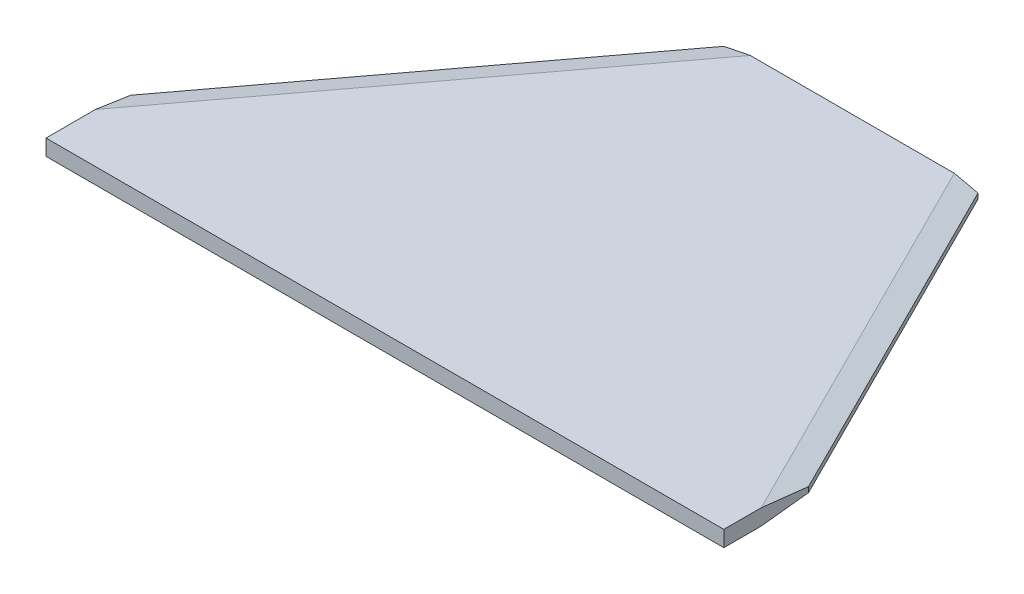
ISO-10303-21;
HEADER;
FILE_DESCRIPTION(('STEP AP214'),'2;1');
FILE_NAME('part.step','',(''),(''),'','','');
FILE_SCHEMA(('AUTOMOTIVE_DESIGN { 1 0 10303 214 1 1 1 1 }'));
ENDSEC;
DATA;
#1=APPLICATION_CONTEXT('core data for automotive mechanical design processes');
#2=APPLICATION_PROTOCOL_DEFINITION('international standard','automotive_design',2000,#1);
#3=PRODUCT_CONTEXT('',#1,'mechanical');
#4=PRODUCT('Part','Part','',(#3));
#5=PRODUCT_RELATED_PRODUCT_CATEGORY('part','',(#4));
#6=PRODUCT_DEFINITION_FORMATION('','',#4);
#7=PRODUCT_DEFINITION_CONTEXT('part definition',#1,'design');
#8=PRODUCT_DEFINITION('design','',#6,#7);
#9=PRODUCT_DEFINITION_SHAPE('','',#8);
#10=(LENGTH_UNIT() NAMED_UNIT(*) SI_UNIT(.MILLI.,.METRE.));
#11=(NAMED_UNIT(*) PLANE_ANGLE_UNIT() SI_UNIT($,.RADIAN.));
#12=(NAMED_UNIT(*) SI_UNIT($,.STERADIAN.) SOLID_ANGLE_UNIT());
#13=UNCERTAINTY_MEASURE_WITH_UNIT(LENGTH_MEASURE(1.E-05),#10,'distance_accuracy_value','');
#14=(GEOMETRIC_REPRESENTATION_CONTEXT(3) GLOBAL_UNCERTAINTY_ASSIGNED_CONTEXT((#13)) GLOBAL_UNIT_ASSIGNED_CONTEXT((#10,
#11,#12)) REPRESENTATION_CONTEXT('',''));
#15=CARTESIAN_POINT('',(0.,0.,0.));
#16=DIRECTION('',(0.,0.,1.));
#17=DIRECTION('',(1.,0.,0.));
#18=AXIS2_PLACEMENT_3D('',#15,#16,#17);
#19=CARTESIAN_POINT('',(76.2,-2.38125,-127.));
#20=DIRECTION('',(0.,0.,1.));
#21=DIRECTION('',(1.,0.,0.));
#22=AXIS2_PLACEMENT_3D('',#19,#20,#21);
#23=PLANE('',#22);
#24=DIRECTION('',(0.,1.,0.));
#25=VECTOR('',#24,1.);
#26=CARTESIAN_POINT('',(76.2,-2.38125,-127.));
#27=LINE('',#26,#25);
#28=CARTESIAN_POINT('',(76.2,-0.793749999999987,-127.));
#29=VERTEX_POINT('',#28);
#30=CARTESIAN_POINT('',(76.2,0.793750000000008,-127.));
#31=VERTEX_POINT('',#30);
#32=EDGE_CURVE('E149',#29,#31,#27,.T.);
#33=ORIENTED_EDGE('',*,*,#32,.T.);
#34=DIRECTION('',(-0.980580675690921,-0.196116135138182,0.));
#35=VECTOR('',#34,1.);
#36=CARTESIAN_POINT('',(2.93076923076917,-13.860096153846,-127.));
#37=LINE('',#36,#35);
#38=CARTESIAN_POINT('',(84.1375000000001,2.38125,-127.));
#39=VERTEX_POINT('',#38);
#40=EDGE_CURVE('E58',#31,#39,#37,.F.);
#41=ORIENTED_EDGE('',*,*,#40,.T.);
#42=DIRECTION('',(1.,0.,0.));
#43=VECTOR('',#42,1.);
#44=CARTESIAN_POINT('',(76.2,2.38125,-127.));
#45=LINE('',#44,#43);
#46=CARTESIAN_POINT('',(145.300484171438,2.38125,-127.));
#47=VERTEX_POINT('',#46);
#48=EDGE_CURVE('E124',#39,#47,#45,.T.);
#49=ORIENTED_EDGE('',*,*,#48,.T.);
#50=DIRECTION('',(-0.975900072948532,0.218217890235998,0.));
#51=VECTOR('',#50,1.);
#52=CARTESIAN_POINT('',(152.4,0.793749999999956,-127.));
#53=LINE('',#52,#51);
#54=CARTESIAN_POINT('',(152.4,0.793749999999956,-127.));
#55=VERTEX_POINT('',#54);
#56=EDGE_CURVE('E167',#47,#55,#53,.F.);
#57=ORIENTED_EDGE('',*,*,#56,.T.);
#58=DIRECTION('',(0.,1.,0.));
#59=VECTOR('',#58,1.);
#60=CARTESIAN_POINT('',(152.4,-2.38125,-127.));
#61=LINE('',#60,#59);
#62=CARTESIAN_POINT('',(152.4,-0.793750000000001,-127.));
#63=VERTEX_POINT('',#62);
#64=EDGE_CURVE('E156',#63,#55,#61,.T.);
#65=ORIENTED_EDGE('',*,*,#64,.F.);
#66=DIRECTION('',(-0.975900072948534,-0.21821789023599,0.));
#67=VECTOR('',#66,1.);
#68=CARTESIAN_POINT('',(166.005153853069,2.2484548859805,-127.));
#69=LINE('',#68,#67);
#70=CARTESIAN_POINT('',(145.300484171438,-2.38125,-127.));
#71=VERTEX_POINT('',#70);
#72=EDGE_CURVE('E165',#63,#71,#69,.T.);
#73=ORIENTED_EDGE('',*,*,#72,.T.);
#74=DIRECTION('',(1.,0.,0.));
#75=VECTOR('',#74,1.);
#76=CARTESIAN_POINT('',(76.2,-2.38125,-127.));
#77=LINE('',#76,#75);
#78=CARTESIAN_POINT('',(84.1375000000002,-2.38125,-127.));
#79=VERTEX_POINT('',#78);
#80=EDGE_CURVE('E137',#79,#71,#77,.T.);
#81=ORIENTED_EDGE('',*,*,#80,.F.);
#82=DIRECTION('',(-0.980580675690921,0.196116135138181,0.));
#83=VECTOR('',#82,1.);
#84=CARTESIAN_POINT('',(-3.60240384615383,15.1667307692305,-127.));
#85=LINE('',#84,#83);
#86=EDGE_CURVE('E169',#79,#29,#85,.T.);
#87=ORIENTED_EDGE('',*,*,#86,.T.);
#88=EDGE_LOOP('',(#33,#41,#49,#57,#65,#73,#81,#87));
#89=FACE_BOUND('',#88,.T.);
#90=ADVANCED_FACE('F35',(#89),#23,.F.);
#91=CARTESIAN_POINT('',(152.4,-2.38125,-127.));
#92=DIRECTION('',(-0.894427190999916,0.,0.447213595499958));
#93=DIRECTION('',(0.447213595499958,0.,0.894427190999916));
#94=AXIS2_PLACEMENT_3D('',#91,#92,#93);
#95=PLANE('',#94);
#96=ORIENTED_EDGE('',*,*,#64,.T.);
#97=DIRECTION('',(0.447213595499958,0.,0.894427190999916));
#98=VECTOR('',#97,1.);
#99=CARTESIAN_POINT('',(152.4,0.793749999999957,-127.));
#100=LINE('',#99,#98);
#101=CARTESIAN_POINT('',(203.2,0.793749999999956,-25.4));
#102=VERTEX_POINT('',#101);
#103=EDGE_CURVE('E177',#55,#102,#100,.T.);
#104=ORIENTED_EDGE('',*,*,#103,.T.);
#105=DIRECTION('',(0.,1.,0.));
#106=VECTOR('',#105,1.);
#107=CARTESIAN_POINT('',(203.2,-2.38125,-25.4));
#108=LINE('',#107,#106);
#109=CARTESIAN_POINT('',(203.2,-0.793750000000001,-25.4));
#110=VERTEX_POINT('',#109);
#111=EDGE_CURVE('E131',#110,#102,#108,.T.);
#112=ORIENTED_EDGE('',*,*,#111,.F.);
#113=DIRECTION('',(-0.447213595499958,0.,-0.894427190999916));
#114=VECTOR('',#113,1.);
#115=CARTESIAN_POINT('',(152.4,-0.793750000000001,-127.));
#116=LINE('',#115,#114);
#117=EDGE_CURVE('E175',#110,#63,#116,.T.);
#118=ORIENTED_EDGE('',*,*,#117,.T.);
#119=EDGE_LOOP('',(#96,#104,#112,#118));
#120=FACE_BOUND('',#119,.T.);
#121=ADVANCED_FACE('F215',(#120),#95,.F.);
#122=CARTESIAN_POINT('',(203.2,-2.38125,-25.4));
#123=DIRECTION('',(-1.,0.,0.));
#124=DIRECTION('',(0.,0.,1.));
#125=AXIS2_PLACEMENT_3D('',#122,#123,#124);
#126=PLANE('',#125);
#127=ORIENTED_EDGE('',*,*,#111,.T.);
#128=DIRECTION('',(0.,-0.111111111111114,-0.993807989999906));
#129=VECTOR('',#128,1.);
#130=CARTESIAN_POINT('',(203.2,-10.4252379759993,-125.745679012346));
#131=LINE('',#130,#129);
#132=CARTESIAN_POINT('',(203.2,2.38125,-11.2009683428763));
#133=VERTEX_POINT('',#132);
#134=EDGE_CURVE('E119',#102,#133,#131,.F.);
#135=ORIENTED_EDGE('',*,*,#134,.T.);
#136=DIRECTION('',(0.,0.,1.));
#137=VECTOR('',#136,1.);
#138=CARTESIAN_POINT('',(203.2,2.38125,-25.4));
#139=LINE('',#138,#137);
#140=CARTESIAN_POINT('',(203.2,2.38125,0.));
#141=VERTEX_POINT('',#140);
#142=EDGE_CURVE('E112',#133,#141,#139,.T.);
#143=ORIENTED_EDGE('',*,*,#142,.T.);
#144=DIRECTION('',(0.,1.,0.));
#145=VECTOR('',#144,1.);
#146=CARTESIAN_POINT('',(203.2,-2.38125,0.));
#147=LINE('',#146,#145);
#148=CARTESIAN_POINT('',(203.2,-2.38125,0.));
#149=VERTEX_POINT('',#148);
#150=EDGE_CURVE('E117',#149,#141,#147,.T.);
#151=ORIENTED_EDGE('',*,*,#150,.F.);
#152=DIRECTION('',(0.,0.,1.));
#153=VECTOR('',#152,1.);
#154=CARTESIAN_POINT('',(203.2,-2.38125,-25.4));
#155=LINE('',#154,#153);
#156=CARTESIAN_POINT('',(203.2,-2.38125,-11.2009683428762));
#157=VERTEX_POINT('',#156);
#158=EDGE_CURVE('E143',#157,#149,#155,.T.);
#159=ORIENTED_EDGE('',*,*,#158,.F.);
#160=DIRECTION('',(0.,0.11111111111111,-0.993807989999907));
#161=VECTOR('',#160,1.);
#162=CARTESIAN_POINT('',(203.2,5.60446377325361,-82.6273637262827));
#163=LINE('',#162,#161);
#164=EDGE_CURVE('E180',#157,#110,#163,.T.);
#165=ORIENTED_EDGE('',*,*,#164,.T.);
#166=EDGE_LOOP('',(#127,#135,#143,#151,#159,#165));
#167=FACE_BOUND('',#166,.T.);
#168=ADVANCED_FACE('F115',(#167),#126,.F.);
#169=CARTESIAN_POINT('',(203.2,-2.38125,0.));
#170=DIRECTION('',(0.,0.,-1.));
#171=DIRECTION('',(-1.,0.,0.));
#172=AXIS2_PLACEMENT_3D('',#169,#170,#171);
#173=PLANE('',#172);
#174=ORIENTED_EDGE('',*,*,#150,.T.);
#175=DIRECTION('',(-1.,0.,0.));
#176=VECTOR('',#175,1.);
#177=CARTESIAN_POINT('',(203.2,2.38125,0.));
#178=LINE('',#177,#176);
#179=CARTESIAN_POINT('',(0.,2.38125,0.));
#180=VERTEX_POINT('',#179);
#181=EDGE_CURVE('E123',#141,#180,#178,.T.);
#182=ORIENTED_EDGE('',*,*,#181,.T.);
#183=DIRECTION('',(0.,1.,0.));
#184=VECTOR('',#183,1.);
#185=CARTESIAN_POINT('',(0.,-2.38125,0.));
#186=LINE('',#185,#184);
#187=CARTESIAN_POINT('',(0.,-2.38125,0.));
#188=VERTEX_POINT('',#187);
#189=EDGE_CURVE('E132',#188,#180,#186,.T.);
#190=ORIENTED_EDGE('',*,*,#189,.F.);
#191=DIRECTION('',(-1.,0.,0.));
#192=VECTOR('',#191,1.);
#193=CARTESIAN_POINT('',(203.2,-2.38125,0.));
#194=LINE('',#193,#192);
#195=EDGE_CURVE('E130',#149,#188,#194,.T.);
#196=ORIENTED_EDGE('',*,*,#195,.F.);
#197=EDGE_LOOP('',(#174,#182,#190,#196));
#198=FACE_BOUND('',#197,.T.);
#199=ADVANCED_FACE('F128',(#198),#173,.F.);
#200=CARTESIAN_POINT('',(0.,-2.38125,0.));
#201=DIRECTION('',(1.,0.,0.));
#202=DIRECTION('',(0.,0.,-1.));
#203=AXIS2_PLACEMENT_3D('',#200,#201,#202);
#204=PLANE('',#203);
#205=DIRECTION('',(0.,0.,-1.));
#206=VECTOR('',#205,1.);
#207=CARTESIAN_POINT('',(0.,2.38125,0.));
#208=LINE('',#207,#206);
#209=CARTESIAN_POINT('',(0.,2.38125,-14.8166666666666));
#210=VERTEX_POINT('',#209);
#211=EDGE_CURVE('E135',#180,#210,#208,.T.);
#212=ORIENTED_EDGE('',*,*,#211,.T.);
#213=DIRECTION('',(0.,0.148340452930243,0.988936352868298));
#214=VECTOR('',#213,1.);
#215=CARTESIAN_POINT('',(0.,0.793750000000008,-25.4));
#216=LINE('',#215,#214);
#217=CARTESIAN_POINT('',(0.,0.793750000000008,-25.4));
#218=VERTEX_POINT('',#217);
#219=EDGE_CURVE('E11',#210,#218,#216,.F.);
#220=ORIENTED_EDGE('',*,*,#219,.T.);
#221=DIRECTION('',(0.,1.,0.));
#222=VECTOR('',#221,1.);
#223=CARTESIAN_POINT('',(0.,-2.38125,-25.4));
#224=LINE('',#223,#222);
#225=CARTESIAN_POINT('',(0.,-0.793749999999987,-25.4));
#226=VERTEX_POINT('',#225);
#227=EDGE_CURVE('E151',#226,#218,#224,.T.);
#228=ORIENTED_EDGE('',*,*,#227,.F.);
#229=DIRECTION('',(0.,-0.148340452930243,0.988936352868298));
#230=VECTOR('',#229,1.);
#231=CARTESIAN_POINT('',(0.,-3.77235024449874,-5.54266503667472));
#232=LINE('',#231,#230);
#233=CARTESIAN_POINT('',(0.,-2.38125,-14.8166666666664));
#234=VERTEX_POINT('',#233);
#235=EDGE_CURVE('E173',#226,#234,#232,.T.);
#236=ORIENTED_EDGE('',*,*,#235,.T.);
#237=DIRECTION('',(0.,0.,-1.));
#238=VECTOR('',#237,1.);
#239=CARTESIAN_POINT('',(0.,-2.38125,0.));
#240=LINE('',#239,#238);
#241=EDGE_CURVE('E146',#188,#234,#240,.T.);
#242=ORIENTED_EDGE('',*,*,#241,.F.);
#243=ORIENTED_EDGE('',*,*,#189,.T.);
#244=EDGE_LOOP('',(#212,#220,#228,#236,#242,#243));
#245=FACE_BOUND('',#244,.T.);
#246=ADVANCED_FACE('F206',(#245),#204,.F.);
#247=CARTESIAN_POINT('',(0.,-2.38125,-25.4));
#248=DIRECTION('',(0.8,0.,0.6));
#249=DIRECTION('',(0.6,0.,-0.8));
#250=AXIS2_PLACEMENT_3D('',#247,#248,#249);
#251=PLANE('',#250);
#252=ORIENTED_EDGE('',*,*,#227,.T.);
#253=DIRECTION('',(0.6,0.,-0.8));
#254=VECTOR('',#253,1.);
#255=CARTESIAN_POINT('',(0.,0.793750000000008,-25.4));
#256=LINE('',#255,#254);
#257=EDGE_CURVE('E185',#218,#31,#256,.T.);
#258=ORIENTED_EDGE('',*,*,#257,.T.);
#259=ORIENTED_EDGE('',*,*,#32,.F.);
#260=DIRECTION('',(-0.6,0.,0.8));
#261=VECTOR('',#260,1.);
#262=CARTESIAN_POINT('',(0.,-0.793749999999987,-25.4));
#263=LINE('',#262,#261);
#264=EDGE_CURVE('E171',#29,#226,#263,.T.);
#265=ORIENTED_EDGE('',*,*,#264,.T.);
#266=EDGE_LOOP('',(#252,#258,#259,#265));
#267=FACE_BOUND('',#266,.T.);
#268=ADVANCED_FACE('F191',(#267),#251,.F.);
#269=CARTESIAN_POINT('',(0.,-2.38125,0.));
#270=DIRECTION('',(0.,-1.,0.));
#271=DIRECTION('',(0.,0.,-1.));
#272=AXIS2_PLACEMENT_3D('',#269,#270,#271);
#273=PLANE('',#272);
#274=ORIENTED_EDGE('',*,*,#241,.T.);
#275=DIRECTION('',(0.6,0.,-0.8));
#276=VECTOR('',#275,1.);
#277=CARTESIAN_POINT('',(81.2800000000001,-2.38125,-123.19));
#278=LINE('',#277,#276);
#279=EDGE_CURVE('E162',#234,#79,#278,.T.);
#280=ORIENTED_EDGE('',*,*,#279,.T.);
#281=ORIENTED_EDGE('',*,*,#80,.T.);
#282=DIRECTION('',(0.447213595499958,0.,0.894427190999916));
#283=VECTOR('',#282,1.);
#284=CARTESIAN_POINT('',(197.52038733715,-2.38125,-22.5601936685752));
#285=LINE('',#284,#283);
#286=EDGE_CURVE('E159',#71,#157,#285,.T.);
#287=ORIENTED_EDGE('',*,*,#286,.T.);
#288=ORIENTED_EDGE('',*,*,#158,.T.);
#289=ORIENTED_EDGE('',*,*,#195,.T.);
#290=EDGE_LOOP('',(#274,#280,#281,#287,#288,#289));
#291=FACE_BOUND('',#290,.T.);
#292=ADVANCED_FACE('F202',(#291),#273,.T.);
#293=CARTESIAN_POINT('',(0.,2.38125,0.));
#294=DIRECTION('',(0.,-1.,0.));
#295=DIRECTION('',(0.,0.,-1.));
#296=AXIS2_PLACEMENT_3D('',#293,#294,#295);
#297=PLANE('',#296);
#298=ORIENTED_EDGE('',*,*,#48,.F.);
#299=DIRECTION('',(-0.6,0.,0.8));
#300=VECTOR('',#299,1.);
#301=CARTESIAN_POINT('',(-7.11199999999997,2.38125,-5.33399999999998));
#302=LINE('',#301,#300);
#303=EDGE_CURVE('E44',#39,#210,#302,.T.);
#304=ORIENTED_EDGE('',*,*,#303,.T.);
#305=ORIENTED_EDGE('',*,*,#211,.F.);
#306=ORIENTED_EDGE('',*,*,#181,.F.);
#307=ORIENTED_EDGE('',*,*,#142,.F.);
#308=DIRECTION('',(-0.447213595499958,0.,-0.894427190999916));
#309=VECTOR('',#308,1.);
#310=CARTESIAN_POINT('',(167.040387337151,2.38125,-83.5201936685752));
#311=LINE('',#310,#309);
#312=EDGE_CURVE('E183',#133,#47,#311,.T.);
#313=ORIENTED_EDGE('',*,*,#312,.T.);
#314=EDGE_LOOP('',(#298,#304,#305,#306,#307,#313));
#315=FACE_BOUND('',#314,.T.);
#316=ADVANCED_FACE('F134',(#315),#297,.F.);
#317=CARTESIAN_POINT('',(-7.11199999999988,-2.38125,-5.33399999999991));
#318=DIRECTION('',(-0.194028500029064,-0.970142500145333,-0.145521375021798));
#319=DIRECTION('',(-0.6,0.,0.8));
#320=AXIS2_PLACEMENT_3D('',#317,#318,#319);
#321=PLANE('',#320);
#322=ORIENTED_EDGE('',*,*,#235,.F.);
#323=ORIENTED_EDGE('',*,*,#264,.F.);
#324=ORIENTED_EDGE('',*,*,#86,.F.);
#325=ORIENTED_EDGE('',*,*,#279,.F.);
#326=EDGE_LOOP('',(#322,#323,#324,#325));
#327=FACE_BOUND('',#326,.T.);
#328=ADVANCED_FACE('F200',(#327),#321,.T.);
#329=CARTESIAN_POINT('',(152.4,0.793749999999956,-127.));
#330=DIRECTION('',(-0.216930457818662,-0.97014250014533,0.108465228909331));
#331=DIRECTION('',(0.447213595499958,0.,0.894427190999916));
#332=AXIS2_PLACEMENT_3D('',#329,#330,#331);
#333=PLANE('',#332);
#334=ORIENTED_EDGE('',*,*,#56,.F.);
#335=ORIENTED_EDGE('',*,*,#312,.F.);
#336=ORIENTED_EDGE('',*,*,#134,.F.);
#337=ORIENTED_EDGE('',*,*,#103,.F.);
#338=EDGE_LOOP('',(#334,#335,#336,#337));
#339=FACE_BOUND('',#338,.T.);
#340=ADVANCED_FACE('F212',(#339),#333,.F.);
#341=CARTESIAN_POINT('',(167.04038733715,-2.38125,-83.5201936685752));
#342=DIRECTION('',(0.216930457818654,-0.970142500145332,-0.108465228909327));
#343=DIRECTION('',(-0.447213595499958,0.,-0.894427190999916));
#344=AXIS2_PLACEMENT_3D('',#341,#342,#343);
#345=PLANE('',#344);
#346=ORIENTED_EDGE('',*,*,#72,.F.);
#347=ORIENTED_EDGE('',*,*,#117,.F.);
#348=ORIENTED_EDGE('',*,*,#164,.F.);
#349=ORIENTED_EDGE('',*,*,#286,.F.);
#350=EDGE_LOOP('',(#346,#347,#348,#349));
#351=FACE_BOUND('',#350,.T.);
#352=ADVANCED_FACE('F208',(#351),#345,.T.);
#353=CARTESIAN_POINT('',(0.,0.793750000000008,-25.4));
#354=DIRECTION('',(0.194028500029064,-0.970142500145332,0.145521375021798));
#355=DIRECTION('',(0.6,0.,-0.8));
#356=AXIS2_PLACEMENT_3D('',#353,#354,#355);
#357=PLANE('',#356);
#358=ORIENTED_EDGE('',*,*,#219,.F.);
#359=ORIENTED_EDGE('',*,*,#303,.F.);
#360=ORIENTED_EDGE('',*,*,#40,.F.);
#361=ORIENTED_EDGE('',*,*,#257,.F.);
#362=EDGE_LOOP('',(#358,#359,#360,#361));
#363=FACE_BOUND('',#362,.T.);
#364=ADVANCED_FACE('F38',(#363),#357,.F.);
#365=CLOSED_SHELL('',(#90,#121,#168,#199,#246,#268,#292,#316,#328,#340,#352,#364));
#366=MANIFOLD_SOLID_BREP('B2',#365);
#367=ADVANCED_BREP_SHAPE_REPRESENTATION('',(#18,#366),#14);
#368=SHAPE_DEFINITION_REPRESENTATION(#9,#367);
ENDSEC;
END-ISO-10303-21;
